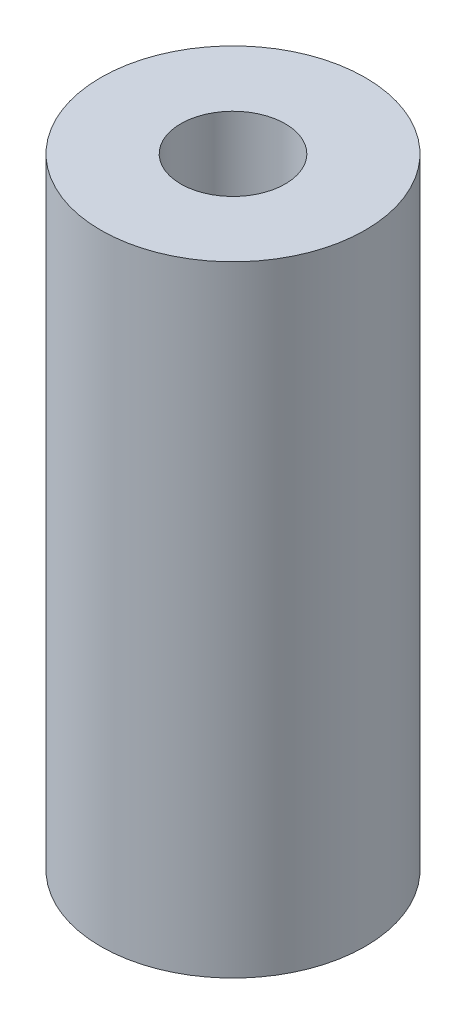
ISO-10303-21;
HEADER;
FILE_DESCRIPTION(('STEP AP214'),'2;1');
FILE_NAME('part.step','',(''),(''),'','','');
FILE_SCHEMA(('AUTOMOTIVE_DESIGN { 1 0 10303 214 1 1 1 1 }'));
ENDSEC;
DATA;
#1=APPLICATION_CONTEXT('core data for automotive mechanical design processes');
#2=APPLICATION_PROTOCOL_DEFINITION('international standard','automotive_design',2000,#1);
#3=PRODUCT_CONTEXT('',#1,'mechanical');
#4=PRODUCT('Part','Part','',(#3));
#5=PRODUCT_RELATED_PRODUCT_CATEGORY('part','',(#4));
#6=PRODUCT_DEFINITION_FORMATION('','',#4);
#7=PRODUCT_DEFINITION_CONTEXT('part definition',#1,'design');
#8=PRODUCT_DEFINITION('design','',#6,#7);
#9=PRODUCT_DEFINITION_SHAPE('','',#8);
#10=(LENGTH_UNIT() NAMED_UNIT(*) SI_UNIT(.MILLI.,.METRE.));
#11=(NAMED_UNIT(*) PLANE_ANGLE_UNIT() SI_UNIT($,.RADIAN.));
#12=(NAMED_UNIT(*) SI_UNIT($,.STERADIAN.) SOLID_ANGLE_UNIT());
#13=UNCERTAINTY_MEASURE_WITH_UNIT(LENGTH_MEASURE(1.E-05),#10,'distance_accuracy_value','');
#14=(GEOMETRIC_REPRESENTATION_CONTEXT(3) GLOBAL_UNCERTAINTY_ASSIGNED_CONTEXT((#13)) GLOBAL_UNIT_ASSIGNED_CONTEXT((#10,
#11,#12)) REPRESENTATION_CONTEXT('',''));
#15=CARTESIAN_POINT('',(0.,0.,0.));
#16=DIRECTION('',(0.,0.,1.));
#17=DIRECTION('',(1.,0.,0.));
#18=AXIS2_PLACEMENT_3D('',#15,#16,#17);
#19=CARTESIAN_POINT('',(0.,19.,0.));
#20=DIRECTION('',(0.,1.,0.));
#21=DIRECTION('',(0.,0.,1.));
#22=AXIS2_PLACEMENT_3D('',#19,#20,#21);
#23=PLANE('',#22);
#24=CARTESIAN_POINT('',(0.,19.,0.));
#25=DIRECTION('',(0.,1.,0.));
#26=DIRECTION('',(0.,0.,1.));
#27=AXIS2_PLACEMENT_3D('',#24,#25,#26);
#28=CIRCLE('',#27,4.05);
#29=CARTESIAN_POINT('',(0.,19.,4.05));
#30=VERTEX_POINT('',#29);
#31=EDGE_CURVE('E10',#30,#30,#28,.T.);
#32=ORIENTED_EDGE('',*,*,#31,.T.);
#33=EDGE_LOOP('',(#32));
#34=FACE_BOUND('',#33,.T.);
#35=CARTESIAN_POINT('',(0.,19.,0.));
#36=DIRECTION('',(0.,1.,0.));
#37=DIRECTION('',(0.,0.,1.));
#38=AXIS2_PLACEMENT_3D('',#35,#36,#37);
#39=CIRCLE('',#38,1.6);
#40=CARTESIAN_POINT('',(0.,19.,1.6));
#41=VERTEX_POINT('',#40);
#42=EDGE_CURVE('E42',#41,#41,#39,.T.);
#43=ORIENTED_EDGE('',*,*,#42,.F.);
#44=EDGE_LOOP('',(#43));
#45=FACE_BOUND('',#44,.T.);
#46=ADVANCED_FACE('F31',(#34,#45),#23,.T.);
#47=CARTESIAN_POINT('',(0.,0.,0.));
#48=DIRECTION('',(0.,1.,0.));
#49=DIRECTION('',(0.,0.,1.));
#50=AXIS2_PLACEMENT_3D('',#47,#48,#49);
#51=PLANE('',#50);
#52=CARTESIAN_POINT('',(0.,0.,0.));
#53=DIRECTION('',(0.,1.,0.));
#54=DIRECTION('',(0.,0.,1.));
#55=AXIS2_PLACEMENT_3D('',#52,#53,#54);
#56=CIRCLE('',#55,4.05);
#57=CARTESIAN_POINT('',(0.,0.,4.05));
#58=VERTEX_POINT('',#57);
#59=EDGE_CURVE('E35',#58,#58,#56,.T.);
#60=ORIENTED_EDGE('',*,*,#59,.F.);
#61=EDGE_LOOP('',(#60));
#62=FACE_BOUND('',#61,.T.);
#63=CARTESIAN_POINT('',(0.,0.,0.));
#64=DIRECTION('',(0.,1.,0.));
#65=DIRECTION('',(0.,0.,1.));
#66=AXIS2_PLACEMENT_3D('',#63,#64,#65);
#67=CIRCLE('',#66,1.6);
#68=CARTESIAN_POINT('',(0.,0.,1.6));
#69=VERTEX_POINT('',#68);
#70=EDGE_CURVE('E44',#69,#69,#67,.T.);
#71=ORIENTED_EDGE('',*,*,#70,.T.);
#72=EDGE_LOOP('',(#71));
#73=FACE_BOUND('',#72,.T.);
#74=ADVANCED_FACE('F54',(#62,#73),#51,.F.);
#75=CARTESIAN_POINT('',(0.,19.,0.));
#76=DIRECTION('',(0.,-1.,0.));
#77=DIRECTION('',(0.,0.,-1.));
#78=AXIS2_PLACEMENT_3D('',#75,#76,#77);
#79=CYLINDRICAL_SURFACE('',#78,4.05);
#80=ORIENTED_EDGE('',*,*,#31,.F.);
#81=EDGE_LOOP('',(#80));
#82=FACE_BOUND('',#81,.T.);
#83=ORIENTED_EDGE('',*,*,#59,.T.);
#84=EDGE_LOOP('',(#83));
#85=FACE_BOUND('',#84,.T.);
#86=ADVANCED_FACE('F33',(#82,#85),#79,.T.);
#87=CARTESIAN_POINT('',(0.,19.,0.));
#88=DIRECTION('',(0.,-1.,0.));
#89=DIRECTION('',(0.,0.,-1.));
#90=AXIS2_PLACEMENT_3D('',#87,#88,#89);
#91=CYLINDRICAL_SURFACE('',#90,1.6);
#92=ORIENTED_EDGE('',*,*,#42,.T.);
#93=EDGE_LOOP('',(#92));
#94=FACE_BOUND('',#93,.T.);
#95=ORIENTED_EDGE('',*,*,#70,.F.);
#96=EDGE_LOOP('',(#95));
#97=FACE_BOUND('',#96,.T.);
#98=ADVANCED_FACE('F50',(#94,#97),#91,.F.);
#99=CLOSED_SHELL('',(#46,#74,#86,#98));
#100=MANIFOLD_SOLID_BREP('B2',#99);
#101=ADVANCED_BREP_SHAPE_REPRESENTATION('',(#18,#100),#14);
#102=SHAPE_DEFINITION_REPRESENTATION(#9,#101);
ENDSEC;
END-ISO-10303-21;
